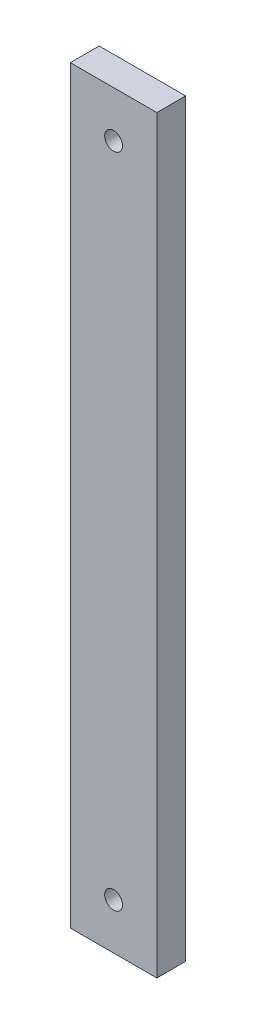
ISO-10303-21;
HEADER;
FILE_DESCRIPTION(('STEP AP214'),'2;1');
FILE_NAME('part.step','',(''),(''),'','','');
FILE_SCHEMA(('AUTOMOTIVE_DESIGN { 1 0 10303 214 1 1 1 1 }'));
ENDSEC;
DATA;
#1=APPLICATION_CONTEXT('core data for automotive mechanical design processes');
#2=APPLICATION_PROTOCOL_DEFINITION('international standard','automotive_design',2000,#1);
#3=PRODUCT_CONTEXT('',#1,'mechanical');
#4=PRODUCT('Part','Part','',(#3));
#5=PRODUCT_RELATED_PRODUCT_CATEGORY('part','',(#4));
#6=PRODUCT_DEFINITION_FORMATION('','',#4);
#7=PRODUCT_DEFINITION_CONTEXT('part definition',#1,'design');
#8=PRODUCT_DEFINITION('design','',#6,#7);
#9=PRODUCT_DEFINITION_SHAPE('','',#8);
#10=(LENGTH_UNIT() NAMED_UNIT(*) SI_UNIT(.MILLI.,.METRE.));
#11=(NAMED_UNIT(*) PLANE_ANGLE_UNIT() SI_UNIT($,.RADIAN.));
#12=(NAMED_UNIT(*) SI_UNIT($,.STERADIAN.) SOLID_ANGLE_UNIT());
#13=UNCERTAINTY_MEASURE_WITH_UNIT(LENGTH_MEASURE(1.E-05),#10,'distance_accuracy_value','');
#14=(GEOMETRIC_REPRESENTATION_CONTEXT(3) GLOBAL_UNCERTAINTY_ASSIGNED_CONTEXT((#13)) GLOBAL_UNIT_ASSIGNED_CONTEXT((#10,
#11,#12)) REPRESENTATION_CONTEXT('',''));
#15=CARTESIAN_POINT('',(0.,0.,0.));
#16=DIRECTION('',(0.,0.,1.));
#17=DIRECTION('',(1.,0.,0.));
#18=AXIS2_PLACEMENT_3D('',#15,#16,#17);
#19=CARTESIAN_POINT('',(0.,0.,5.));
#20=DIRECTION('',(0.,0.,-1.));
#21=DIRECTION('',(-1.,0.,0.));
#22=AXIS2_PLACEMENT_3D('',#19,#20,#21);
#23=PLANE('',#22);
#24=DIRECTION('',(0.,1.,0.));
#25=VECTOR('',#24,1.);
#26=CARTESIAN_POINT('',(7.5,-65.,5.));
#27=LINE('',#26,#25);
#28=CARTESIAN_POINT('',(7.5,-65.,5.));
#29=VERTEX_POINT('',#28);
#30=CARTESIAN_POINT('',(7.5,65.,5.));
#31=VERTEX_POINT('',#30);
#32=EDGE_CURVE('E84',#29,#31,#27,.T.);
#33=ORIENTED_EDGE('',*,*,#32,.T.);
#34=DIRECTION('',(-1.,0.,0.));
#35=VECTOR('',#34,1.);
#36=CARTESIAN_POINT('',(-7.5,65.,5.));
#37=LINE('',#36,#35);
#38=CARTESIAN_POINT('',(-7.5,65.,5.));
#39=VERTEX_POINT('',#38);
#40=EDGE_CURVE('E79',#31,#39,#37,.T.);
#41=ORIENTED_EDGE('',*,*,#40,.T.);
#42=DIRECTION('',(0.,-1.,0.));
#43=VECTOR('',#42,1.);
#44=CARTESIAN_POINT('',(-7.5,-65.,5.));
#45=LINE('',#44,#43);
#46=CARTESIAN_POINT('',(-7.5,-65.,5.));
#47=VERTEX_POINT('',#46);
#48=EDGE_CURVE('E82',#39,#47,#45,.T.);
#49=ORIENTED_EDGE('',*,*,#48,.T.);
#50=DIRECTION('',(1.,0.,0.));
#51=VECTOR('',#50,1.);
#52=CARTESIAN_POINT('',(-7.5,-65.,5.));
#53=LINE('',#52,#51);
#54=EDGE_CURVE('E49',#47,#29,#53,.T.);
#55=ORIENTED_EDGE('',*,*,#54,.T.);
#56=EDGE_LOOP('',(#33,#41,#49,#55));
#57=FACE_BOUND('',#56,.T.);
#58=CARTESIAN_POINT('',(0.,57.,5.));
#59=DIRECTION('',(0.,0.,1.));
#60=DIRECTION('',(1.,0.,0.));
#61=AXIS2_PLACEMENT_3D('',#58,#59,#60);
#62=CIRCLE('',#61,1.55);
#63=CARTESIAN_POINT('',(1.55,57.,5.));
#64=VERTEX_POINT('',#63);
#65=EDGE_CURVE('E99',#64,#64,#62,.T.);
#66=ORIENTED_EDGE('',*,*,#65,.F.);
#67=EDGE_LOOP('',(#66));
#68=FACE_BOUND('',#67,.T.);
#69=CARTESIAN_POINT('',(0.,-57.,5.));
#70=DIRECTION('',(0.,0.,1.));
#71=DIRECTION('',(1.,0.,0.));
#72=AXIS2_PLACEMENT_3D('',#69,#70,#71);
#73=CIRCLE('',#72,1.55);
#74=CARTESIAN_POINT('',(1.55,-57.,5.));
#75=VERTEX_POINT('',#74);
#76=EDGE_CURVE('E114',#75,#75,#73,.T.);
#77=ORIENTED_EDGE('',*,*,#76,.F.);
#78=EDGE_LOOP('',(#77));
#79=FACE_BOUND('',#78,.T.);
#80=ADVANCED_FACE('F32',(#57,#68,#79),#23,.F.);
#81=CARTESIAN_POINT('',(0.,0.,0.));
#82=DIRECTION('',(0.,0.,-1.));
#83=DIRECTION('',(-1.,0.,0.));
#84=AXIS2_PLACEMENT_3D('',#81,#82,#83);
#85=PLANE('',#84);
#86=CARTESIAN_POINT('',(0.,57.,0.));
#87=DIRECTION('',(0.,0.,1.));
#88=DIRECTION('',(1.,0.,0.));
#89=AXIS2_PLACEMENT_3D('',#86,#87,#88);
#90=CIRCLE('',#89,1.55);
#91=CARTESIAN_POINT('',(1.55,57.,0.));
#92=VERTEX_POINT('',#91);
#93=EDGE_CURVE('E111',#92,#92,#90,.T.);
#94=ORIENTED_EDGE('',*,*,#93,.T.);
#95=EDGE_LOOP('',(#94));
#96=FACE_BOUND('',#95,.T.);
#97=DIRECTION('',(0.,1.,0.));
#98=VECTOR('',#97,1.);
#99=CARTESIAN_POINT('',(7.5,-65.,0.));
#100=LINE('',#99,#98);
#101=CARTESIAN_POINT('',(7.5,-65.,0.));
#102=VERTEX_POINT('',#101);
#103=CARTESIAN_POINT('',(7.5,65.,0.));
#104=VERTEX_POINT('',#103);
#105=EDGE_CURVE('E96',#102,#104,#100,.T.);
#106=ORIENTED_EDGE('',*,*,#105,.F.);
#107=DIRECTION('',(1.,0.,0.));
#108=VECTOR('',#107,1.);
#109=CARTESIAN_POINT('',(-7.5,-65.,0.));
#110=LINE('',#109,#108);
#111=CARTESIAN_POINT('',(-7.5,-65.,0.));
#112=VERTEX_POINT('',#111);
#113=EDGE_CURVE('E72',#112,#102,#110,.T.);
#114=ORIENTED_EDGE('',*,*,#113,.F.);
#115=DIRECTION('',(0.,-1.,0.));
#116=VECTOR('',#115,1.);
#117=CARTESIAN_POINT('',(-7.5,-65.,0.));
#118=LINE('',#117,#116);
#119=CARTESIAN_POINT('',(-7.5,65.,0.));
#120=VERTEX_POINT('',#119);
#121=EDGE_CURVE('E66',#120,#112,#118,.T.);
#122=ORIENTED_EDGE('',*,*,#121,.F.);
#123=DIRECTION('',(-1.,0.,0.));
#124=VECTOR('',#123,1.);
#125=CARTESIAN_POINT('',(-7.5,65.,0.));
#126=LINE('',#125,#124);
#127=EDGE_CURVE('E88',#104,#120,#126,.T.);
#128=ORIENTED_EDGE('',*,*,#127,.F.);
#129=EDGE_LOOP('',(#106,#114,#122,#128));
#130=FACE_BOUND('',#129,.T.);
#131=CARTESIAN_POINT('',(0.,-57.,0.));
#132=DIRECTION('',(0.,0.,1.));
#133=DIRECTION('',(1.,0.,0.));
#134=AXIS2_PLACEMENT_3D('',#131,#132,#133);
#135=CIRCLE('',#134,1.55);
#136=CARTESIAN_POINT('',(1.55,-57.,0.));
#137=VERTEX_POINT('',#136);
#138=EDGE_CURVE('E117',#137,#137,#135,.T.);
#139=ORIENTED_EDGE('',*,*,#138,.T.);
#140=EDGE_LOOP('',(#139));
#141=FACE_BOUND('',#140,.T.);
#142=ADVANCED_FACE('F107',(#96,#130,#141),#85,.T.);
#143=CARTESIAN_POINT('',(7.5,-65.,5.));
#144=DIRECTION('',(-1.,0.,0.));
#145=DIRECTION('',(0.,0.,1.));
#146=AXIS2_PLACEMENT_3D('',#143,#144,#145);
#147=PLANE('',#146);
#148=ORIENTED_EDGE('',*,*,#105,.T.);
#149=DIRECTION('',(0.,0.,-1.));
#150=VECTOR('',#149,1.);
#151=CARTESIAN_POINT('',(7.5,65.,5.));
#152=LINE('',#151,#150);
#153=EDGE_CURVE('E11',#31,#104,#152,.T.);
#154=ORIENTED_EDGE('',*,*,#153,.F.);
#155=ORIENTED_EDGE('',*,*,#32,.F.);
#156=DIRECTION('',(0.,0.,-1.));
#157=VECTOR('',#156,1.);
#158=CARTESIAN_POINT('',(7.5,-65.,5.));
#159=LINE('',#158,#157);
#160=EDGE_CURVE('E92',#29,#102,#159,.T.);
#161=ORIENTED_EDGE('',*,*,#160,.T.);
#162=EDGE_LOOP('',(#148,#154,#155,#161));
#163=FACE_BOUND('',#162,.T.);
#164=ADVANCED_FACE('F34',(#163),#147,.F.);
#165=CARTESIAN_POINT('',(-7.5,65.,5.));
#166=DIRECTION('',(0.,-1.,0.));
#167=DIRECTION('',(0.,0.,-1.));
#168=AXIS2_PLACEMENT_3D('',#165,#166,#167);
#169=PLANE('',#168);
#170=ORIENTED_EDGE('',*,*,#127,.T.);
#171=DIRECTION('',(0.,0.,-1.));
#172=VECTOR('',#171,1.);
#173=CARTESIAN_POINT('',(-7.5,65.,5.));
#174=LINE('',#173,#172);
#175=EDGE_CURVE('E41',#39,#120,#174,.T.);
#176=ORIENTED_EDGE('',*,*,#175,.F.);
#177=ORIENTED_EDGE('',*,*,#40,.F.);
#178=ORIENTED_EDGE('',*,*,#153,.T.);
#179=EDGE_LOOP('',(#170,#176,#177,#178));
#180=FACE_BOUND('',#179,.T.);
#181=ADVANCED_FACE('F87',(#180),#169,.F.);
#182=CARTESIAN_POINT('',(-7.5,-65.,5.));
#183=DIRECTION('',(1.,0.,0.));
#184=DIRECTION('',(0.,0.,-1.));
#185=AXIS2_PLACEMENT_3D('',#182,#183,#184);
#186=PLANE('',#185);
#187=ORIENTED_EDGE('',*,*,#121,.T.);
#188=DIRECTION('',(0.,0.,-1.));
#189=VECTOR('',#188,1.);
#190=CARTESIAN_POINT('',(-7.5,-65.,5.));
#191=LINE('',#190,#189);
#192=EDGE_CURVE('E89',#47,#112,#191,.T.);
#193=ORIENTED_EDGE('',*,*,#192,.F.);
#194=ORIENTED_EDGE('',*,*,#48,.F.);
#195=ORIENTED_EDGE('',*,*,#175,.T.);
#196=EDGE_LOOP('',(#187,#193,#194,#195));
#197=FACE_BOUND('',#196,.T.);
#198=ADVANCED_FACE('F90',(#197),#186,.F.);
#199=CARTESIAN_POINT('',(-7.5,-65.,5.));
#200=DIRECTION('',(0.,1.,0.));
#201=DIRECTION('',(0.,0.,1.));
#202=AXIS2_PLACEMENT_3D('',#199,#200,#201);
#203=PLANE('',#202);
#204=ORIENTED_EDGE('',*,*,#113,.T.);
#205=ORIENTED_EDGE('',*,*,#160,.F.);
#206=ORIENTED_EDGE('',*,*,#54,.F.);
#207=ORIENTED_EDGE('',*,*,#192,.T.);
#208=EDGE_LOOP('',(#204,#205,#206,#207));
#209=FACE_BOUND('',#208,.T.);
#210=ADVANCED_FACE('F104',(#209),#203,.F.);
#211=CARTESIAN_POINT('',(0.,57.,5.));
#212=DIRECTION('',(0.,0.,-1.));
#213=DIRECTION('',(-1.,0.,0.));
#214=AXIS2_PLACEMENT_3D('',#211,#212,#213);
#215=CYLINDRICAL_SURFACE('',#214,1.55);
#216=ORIENTED_EDGE('',*,*,#65,.T.);
#217=EDGE_LOOP('',(#216));
#218=FACE_BOUND('',#217,.T.);
#219=ORIENTED_EDGE('',*,*,#93,.F.);
#220=EDGE_LOOP('',(#219));
#221=FACE_BOUND('',#220,.T.);
#222=ADVANCED_FACE('F134',(#218,#221),#215,.F.);
#223=CARTESIAN_POINT('',(0.,-57.,5.));
#224=DIRECTION('',(0.,0.,-1.));
#225=DIRECTION('',(-1.,0.,0.));
#226=AXIS2_PLACEMENT_3D('',#223,#224,#225);
#227=CYLINDRICAL_SURFACE('',#226,1.55);
#228=ORIENTED_EDGE('',*,*,#76,.T.);
#229=EDGE_LOOP('',(#228));
#230=FACE_BOUND('',#229,.T.);
#231=ORIENTED_EDGE('',*,*,#138,.F.);
#232=EDGE_LOOP('',(#231));
#233=FACE_BOUND('',#232,.T.);
#234=ADVANCED_FACE('F123',(#230,#233),#227,.F.);
#235=CLOSED_SHELL('',(#80,#142,#164,#181,#198,#210,#222,#234));
#236=MANIFOLD_SOLID_BREP('B2',#235);
#237=ADVANCED_BREP_SHAPE_REPRESENTATION('',(#18,#236),#14);
#238=SHAPE_DEFINITION_REPRESENTATION(#9,#237);
ENDSEC;
END-ISO-10303-21;
